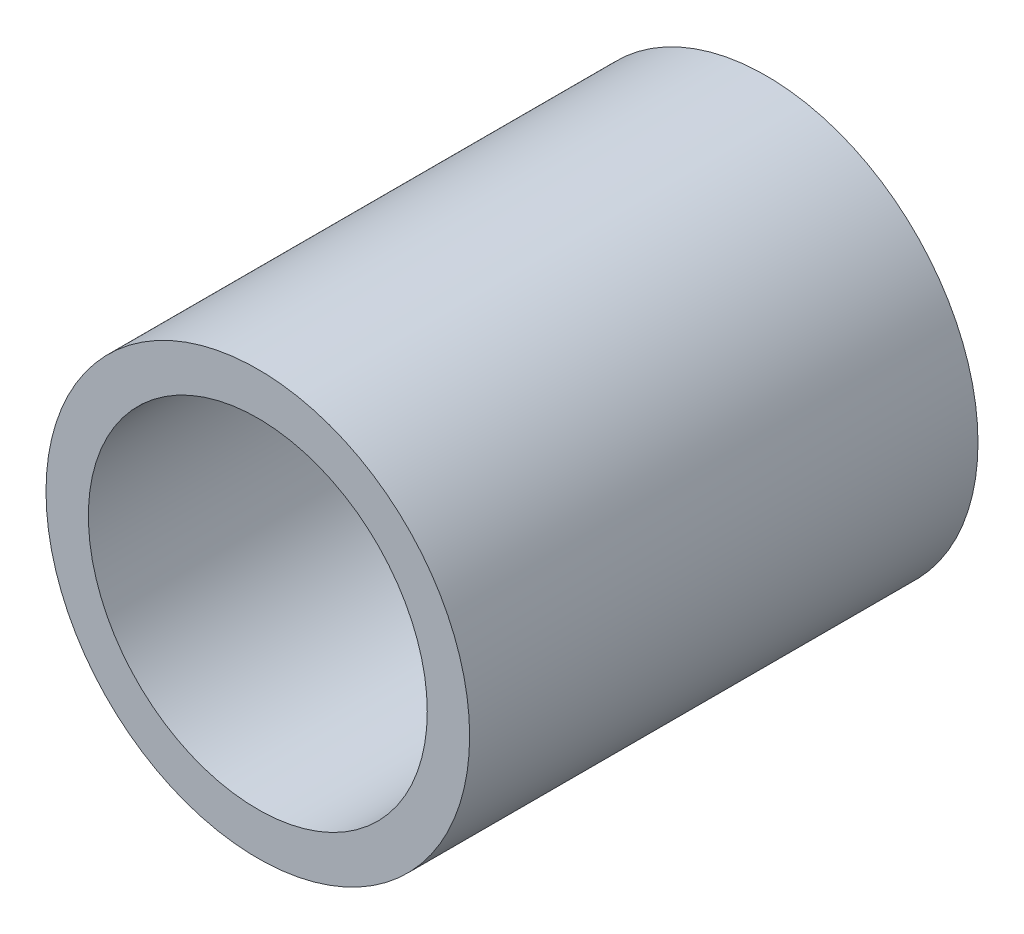
ISO-10303-21;
HEADER;
FILE_DESCRIPTION(('STEP AP214'),'2;1');
FILE_NAME('part.step','',(''),(''),'','','');
FILE_SCHEMA(('AUTOMOTIVE_DESIGN { 1 0 10303 214 1 1 1 1 }'));
ENDSEC;
DATA;
#1=APPLICATION_CONTEXT('core data for automotive mechanical design processes');
#2=APPLICATION_PROTOCOL_DEFINITION('international standard','automotive_design',2000,#1);
#3=PRODUCT_CONTEXT('',#1,'mechanical');
#4=PRODUCT('Part','Part','',(#3));
#5=PRODUCT_RELATED_PRODUCT_CATEGORY('part','',(#4));
#6=PRODUCT_DEFINITION_FORMATION('','',#4);
#7=PRODUCT_DEFINITION_CONTEXT('part definition',#1,'design');
#8=PRODUCT_DEFINITION('design','',#6,#7);
#9=PRODUCT_DEFINITION_SHAPE('','',#8);
#10=(LENGTH_UNIT() NAMED_UNIT(*) SI_UNIT(.MILLI.,.METRE.));
#11=(NAMED_UNIT(*) PLANE_ANGLE_UNIT() SI_UNIT($,.RADIAN.));
#12=(NAMED_UNIT(*) SI_UNIT($,.STERADIAN.) SOLID_ANGLE_UNIT());
#13=UNCERTAINTY_MEASURE_WITH_UNIT(LENGTH_MEASURE(1.E-05),#10,'distance_accuracy_value','');
#14=(GEOMETRIC_REPRESENTATION_CONTEXT(3) GLOBAL_UNCERTAINTY_ASSIGNED_CONTEXT((#13)) GLOBAL_UNIT_ASSIGNED_CONTEXT((#10,
#11,#12)) REPRESENTATION_CONTEXT('',''));
#15=CARTESIAN_POINT('',(0.,0.,0.));
#16=DIRECTION('',(0.,0.,1.));
#17=DIRECTION('',(1.,0.,0.));
#18=AXIS2_PLACEMENT_3D('',#15,#16,#17);
#19=CARTESIAN_POINT('',(0.,0.,15.));
#20=DIRECTION('',(0.,0.,1.));
#21=DIRECTION('',(1.,0.,0.));
#22=AXIS2_PLACEMENT_3D('',#19,#20,#21);
#23=PLANE('',#22);
#24=CARTESIAN_POINT('',(0.,0.,15.));
#25=DIRECTION('',(0.,0.,1.));
#26=DIRECTION('',(1.,0.,0.));
#27=AXIS2_PLACEMENT_3D('',#24,#25,#26);
#28=CIRCLE('',#27,12.5);
#29=CARTESIAN_POINT('',(12.5,0.,15.));
#30=VERTEX_POINT('',#29);
#31=EDGE_CURVE('E10',#30,#30,#28,.T.);
#32=ORIENTED_EDGE('',*,*,#31,.T.);
#33=EDGE_LOOP('',(#32));
#34=FACE_BOUND('',#33,.T.);
#35=CARTESIAN_POINT('',(0.,0.,15.));
#36=DIRECTION('',(0.,0.,1.));
#37=DIRECTION('',(1.,0.,0.));
#38=AXIS2_PLACEMENT_3D('',#35,#36,#37);
#39=CIRCLE('',#38,10.);
#40=CARTESIAN_POINT('',(10.,0.,15.));
#41=VERTEX_POINT('',#40);
#42=EDGE_CURVE('E50',#41,#41,#39,.T.);
#43=ORIENTED_EDGE('',*,*,#42,.F.);
#44=EDGE_LOOP('',(#43));
#45=FACE_BOUND('',#44,.T.);
#46=ADVANCED_FACE('F37',(#34,#45),#23,.T.);
#47=CARTESIAN_POINT('',(0.,0.,-15.));
#48=DIRECTION('',(0.,0.,1.));
#49=DIRECTION('',(1.,0.,0.));
#50=AXIS2_PLACEMENT_3D('',#47,#48,#49);
#51=PLANE('',#50);
#52=CARTESIAN_POINT('',(0.,0.,-15.));
#53=DIRECTION('',(0.,0.,1.));
#54=DIRECTION('',(1.,0.,0.));
#55=AXIS2_PLACEMENT_3D('',#52,#53,#54);
#56=CIRCLE('',#55,12.5);
#57=CARTESIAN_POINT('',(12.5,0.,-15.));
#58=VERTEX_POINT('',#57);
#59=EDGE_CURVE('E41',#58,#58,#56,.T.);
#60=ORIENTED_EDGE('',*,*,#59,.F.);
#61=EDGE_LOOP('',(#60));
#62=FACE_BOUND('',#61,.T.);
#63=CARTESIAN_POINT('',(0.,0.,-15.));
#64=DIRECTION('',(0.,0.,1.));
#65=DIRECTION('',(1.,0.,0.));
#66=AXIS2_PLACEMENT_3D('',#63,#64,#65);
#67=CIRCLE('',#66,10.);
#68=CARTESIAN_POINT('',(10.,0.,-15.));
#69=VERTEX_POINT('',#68);
#70=EDGE_CURVE('E52',#69,#69,#67,.T.);
#71=ORIENTED_EDGE('',*,*,#70,.T.);
#72=EDGE_LOOP('',(#71));
#73=FACE_BOUND('',#72,.T.);
#74=ADVANCED_FACE('F64',(#62,#73),#51,.F.);
#75=CARTESIAN_POINT('',(0.,0.,15.));
#76=DIRECTION('',(0.,0.,-1.));
#77=DIRECTION('',(-1.,0.,0.));
#78=AXIS2_PLACEMENT_3D('',#75,#76,#77);
#79=CYLINDRICAL_SURFACE('',#78,12.5);
#80=ORIENTED_EDGE('',*,*,#31,.F.);
#81=EDGE_LOOP('',(#80));
#82=FACE_BOUND('',#81,.T.);
#83=ORIENTED_EDGE('',*,*,#59,.T.);
#84=EDGE_LOOP('',(#83));
#85=FACE_BOUND('',#84,.T.);
#86=ADVANCED_FACE('F39',(#82,#85),#79,.T.);
#87=CARTESIAN_POINT('',(0.,0.,15.));
#88=DIRECTION('',(0.,0.,-1.));
#89=DIRECTION('',(-1.,0.,0.));
#90=AXIS2_PLACEMENT_3D('',#87,#88,#89);
#91=CYLINDRICAL_SURFACE('',#90,10.);
#92=ORIENTED_EDGE('',*,*,#42,.T.);
#93=EDGE_LOOP('',(#92));
#94=FACE_BOUND('',#93,.T.);
#95=ORIENTED_EDGE('',*,*,#70,.F.);
#96=EDGE_LOOP('',(#95));
#97=FACE_BOUND('',#96,.T.);
#98=ADVANCED_FACE('F60',(#94,#97),#91,.F.);
#99=CLOSED_SHELL('',(#46,#74,#86,#98));
#100=MANIFOLD_SOLID_BREP('B2',#99);
#101=ADVANCED_BREP_SHAPE_REPRESENTATION('',(#18,#100),#14);
#102=SHAPE_DEFINITION_REPRESENTATION(#9,#101);
ENDSEC;
END-ISO-10303-21;
